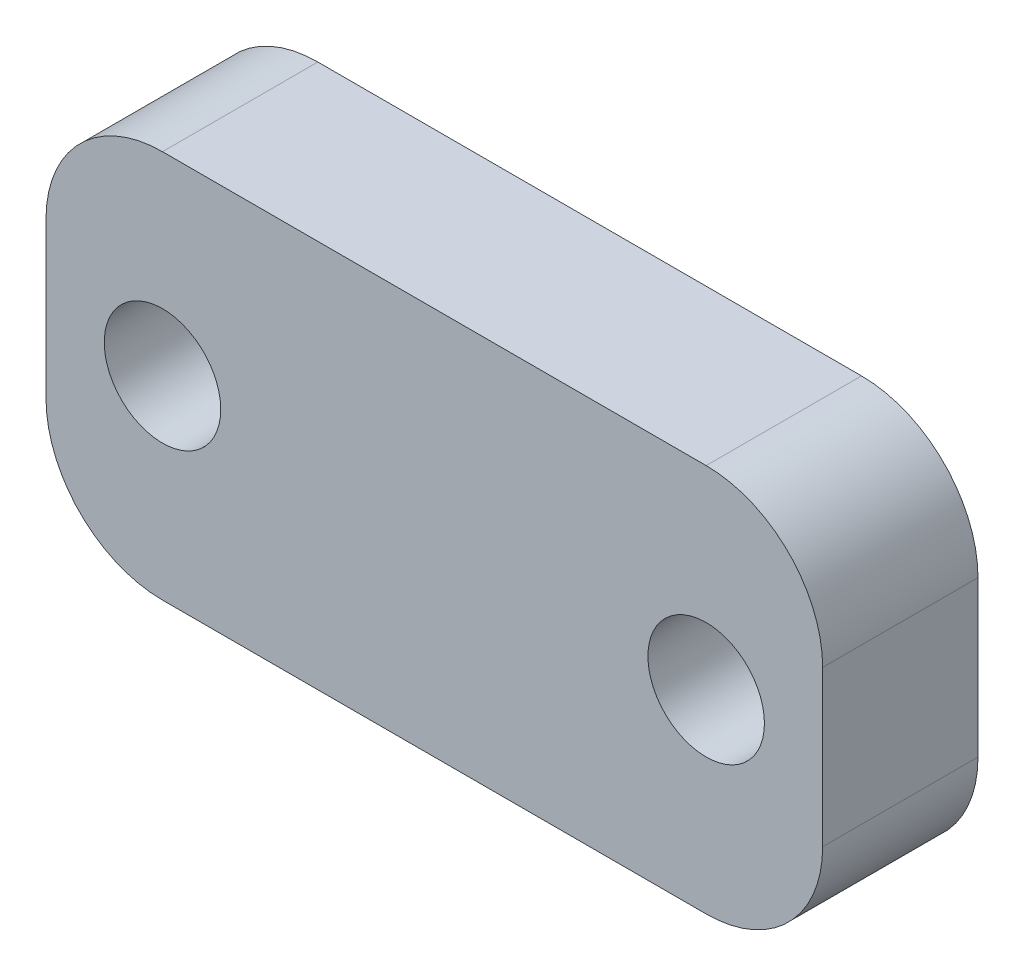
ISO-10303-21;
HEADER;
FILE_DESCRIPTION(('STEP AP214'),'2;1');
FILE_NAME('part.step','',(''),(''),'','','');
FILE_SCHEMA(('AUTOMOTIVE_DESIGN { 1 0 10303 214 1 1 1 1 }'));
ENDSEC;
DATA;
#1=APPLICATION_CONTEXT('core data for automotive mechanical design processes');
#2=APPLICATION_PROTOCOL_DEFINITION('international standard','automotive_design',2000,#1);
#3=PRODUCT_CONTEXT('',#1,'mechanical');
#4=PRODUCT('Part','Part','',(#3));
#5=PRODUCT_RELATED_PRODUCT_CATEGORY('part','',(#4));
#6=PRODUCT_DEFINITION_FORMATION('','',#4);
#7=PRODUCT_DEFINITION_CONTEXT('part definition',#1,'design');
#8=PRODUCT_DEFINITION('design','',#6,#7);
#9=PRODUCT_DEFINITION_SHAPE('','',#8);
#10=(LENGTH_UNIT() NAMED_UNIT(*) SI_UNIT(.MILLI.,.METRE.));
#11=(NAMED_UNIT(*) PLANE_ANGLE_UNIT() SI_UNIT($,.RADIAN.));
#12=(NAMED_UNIT(*) SI_UNIT($,.STERADIAN.) SOLID_ANGLE_UNIT());
#13=UNCERTAINTY_MEASURE_WITH_UNIT(LENGTH_MEASURE(1.E-05),#10,'distance_accuracy_value','');
#14=(GEOMETRIC_REPRESENTATION_CONTEXT(3) GLOBAL_UNCERTAINTY_ASSIGNED_CONTEXT((#13)) GLOBAL_UNIT_ASSIGNED_CONTEXT((#10,
#11,#12)) REPRESENTATION_CONTEXT('',''));
#15=CARTESIAN_POINT('',(0.,0.,0.));
#16=DIRECTION('',(0.,0.,1.));
#17=DIRECTION('',(1.,0.,0.));
#18=AXIS2_PLACEMENT_3D('',#15,#16,#17);
#19=CARTESIAN_POINT('',(-7.,-2.,4.));
#20=DIRECTION('',(0.,0.,1.));
#21=DIRECTION('',(1.,0.,0.));
#22=AXIS2_PLACEMENT_3D('',#19,#20,#21);
#23=PLANE('',#22);
#24=CARTESIAN_POINT('',(-7.,0.,4.));
#25=DIRECTION('',(0.,0.,1.));
#26=DIRECTION('',(1.,0.,0.));
#27=AXIS2_PLACEMENT_3D('',#24,#25,#26);
#28=CIRCLE('',#27,1.5);
#29=CARTESIAN_POINT('',(-5.5,0.,4.));
#30=VERTEX_POINT('',#29);
#31=EDGE_CURVE('E136',#30,#30,#28,.T.);
#32=ORIENTED_EDGE('',*,*,#31,.F.);
#33=EDGE_LOOP('',(#32));
#34=FACE_BOUND('',#33,.T.);
#35=CARTESIAN_POINT('',(-7.,-2.,4.));
#36=DIRECTION('',(0.,0.,1.));
#37=DIRECTION('',(1.,0.,0.));
#38=AXIS2_PLACEMENT_3D('',#35,#36,#37);
#39=CIRCLE('',#38,3.);
#40=CARTESIAN_POINT('',(-10.,-1.99999999999998,4.));
#41=VERTEX_POINT('',#40);
#42=CARTESIAN_POINT('',(-6.99999999999998,-5.,4.));
#43=VERTEX_POINT('',#42);
#44=EDGE_CURVE('E147',#41,#43,#39,.T.);
#45=ORIENTED_EDGE('',*,*,#44,.T.);
#46=DIRECTION('',(1.,0.,0.));
#47=VECTOR('',#46,1.);
#48=CARTESIAN_POINT('',(-6.99999999999998,-5.,4.));
#49=LINE('',#48,#47);
#50=CARTESIAN_POINT('',(6.99999999999998,-5.,4.));
#51=VERTEX_POINT('',#50);
#52=EDGE_CURVE('E95',#43,#51,#49,.T.);
#53=ORIENTED_EDGE('',*,*,#52,.T.);
#54=CARTESIAN_POINT('',(7.,-2.,4.));
#55=DIRECTION('',(0.,0.,1.));
#56=DIRECTION('',(1.,0.,0.));
#57=AXIS2_PLACEMENT_3D('',#54,#55,#56);
#58=CIRCLE('',#57,3.);
#59=CARTESIAN_POINT('',(10.,-1.99999999999998,4.));
#60=VERTEX_POINT('',#59);
#61=EDGE_CURVE('E162',#51,#60,#58,.T.);
#62=ORIENTED_EDGE('',*,*,#61,.T.);
#63=DIRECTION('',(0.,1.,0.));
#64=VECTOR('',#63,1.);
#65=CARTESIAN_POINT('',(10.,1.99999999999998,4.));
#66=LINE('',#65,#64);
#67=CARTESIAN_POINT('',(10.,1.99999999999998,4.));
#68=VERTEX_POINT('',#67);
#69=EDGE_CURVE('E175',#60,#68,#66,.T.);
#70=ORIENTED_EDGE('',*,*,#69,.T.);
#71=CARTESIAN_POINT('',(7.,2.,4.));
#72=DIRECTION('',(0.,0.,1.));
#73=DIRECTION('',(-1.,0.,0.));
#74=AXIS2_PLACEMENT_3D('',#71,#72,#73);
#75=CIRCLE('',#74,3.);
#76=CARTESIAN_POINT('',(6.99999999999998,5.,4.));
#77=VERTEX_POINT('',#76);
#78=EDGE_CURVE('E114',#68,#77,#75,.T.);
#79=ORIENTED_EDGE('',*,*,#78,.T.);
#80=DIRECTION('',(-1.,0.,0.));
#81=VECTOR('',#80,1.);
#82=CARTESIAN_POINT('',(-6.99999999999998,5.,4.));
#83=LINE('',#82,#81);
#84=CARTESIAN_POINT('',(-6.99999999999998,5.,4.));
#85=VERTEX_POINT('',#84);
#86=EDGE_CURVE('E108',#77,#85,#83,.T.);
#87=ORIENTED_EDGE('',*,*,#86,.T.);
#88=CARTESIAN_POINT('',(-7.,2.,4.));
#89=DIRECTION('',(0.,0.,1.));
#90=DIRECTION('',(1.,0.,0.));
#91=AXIS2_PLACEMENT_3D('',#88,#89,#90);
#92=CIRCLE('',#91,3.);
#93=CARTESIAN_POINT('',(-10.,1.99999999999998,4.));
#94=VERTEX_POINT('',#93);
#95=EDGE_CURVE('E112',#85,#94,#92,.T.);
#96=ORIENTED_EDGE('',*,*,#95,.T.);
#97=DIRECTION('',(0.,-1.,0.));
#98=VECTOR('',#97,1.);
#99=CARTESIAN_POINT('',(-10.,1.99999999999998,4.));
#100=LINE('',#99,#98);
#101=EDGE_CURVE('E52',#94,#41,#100,.T.);
#102=ORIENTED_EDGE('',*,*,#101,.T.);
#103=EDGE_LOOP('',(#45,#53,#62,#70,#79,#87,#96,#102));
#104=FACE_BOUND('',#103,.T.);
#105=CARTESIAN_POINT('',(7.,0.,4.));
#106=DIRECTION('',(0.,0.,1.));
#107=DIRECTION('',(1.,0.,0.));
#108=AXIS2_PLACEMENT_3D('',#105,#106,#107);
#109=CIRCLE('',#108,1.5);
#110=CARTESIAN_POINT('',(8.5,0.,4.));
#111=VERTEX_POINT('',#110);
#112=EDGE_CURVE('E184',#111,#111,#109,.T.);
#113=ORIENTED_EDGE('',*,*,#112,.F.);
#114=EDGE_LOOP('',(#113));
#115=FACE_BOUND('',#114,.T.);
#116=ADVANCED_FACE('F35',(#34,#104,#115),#23,.T.);
#117=CARTESIAN_POINT('',(-7.,-2.,0.));
#118=DIRECTION('',(0.,0.,1.));
#119=DIRECTION('',(1.,0.,0.));
#120=AXIS2_PLACEMENT_3D('',#117,#118,#119);
#121=PLANE('',#120);
#122=CARTESIAN_POINT('',(-7.,-2.,0.));
#123=DIRECTION('',(0.,0.,1.));
#124=DIRECTION('',(1.,0.,0.));
#125=AXIS2_PLACEMENT_3D('',#122,#123,#124);
#126=CIRCLE('',#125,3.);
#127=CARTESIAN_POINT('',(-10.,-1.99999999999998,0.));
#128=VERTEX_POINT('',#127);
#129=CARTESIAN_POINT('',(-6.99999999999998,-5.,0.));
#130=VERTEX_POINT('',#129);
#131=EDGE_CURVE('E132',#128,#130,#126,.T.);
#132=ORIENTED_EDGE('',*,*,#131,.F.);
#133=DIRECTION('',(0.,-1.,0.));
#134=VECTOR('',#133,1.);
#135=CARTESIAN_POINT('',(-10.,1.99999999999998,0.));
#136=LINE('',#135,#134);
#137=CARTESIAN_POINT('',(-10.,1.99999999999998,0.));
#138=VERTEX_POINT('',#137);
#139=EDGE_CURVE('E87',#138,#128,#136,.T.);
#140=ORIENTED_EDGE('',*,*,#139,.F.);
#141=CARTESIAN_POINT('',(-7.,2.,0.));
#142=DIRECTION('',(0.,0.,1.));
#143=DIRECTION('',(1.,0.,0.));
#144=AXIS2_PLACEMENT_3D('',#141,#142,#143);
#145=CIRCLE('',#144,3.);
#146=CARTESIAN_POINT('',(-6.99999999999998,5.,0.));
#147=VERTEX_POINT('',#146);
#148=EDGE_CURVE('E81',#147,#138,#145,.T.);
#149=ORIENTED_EDGE('',*,*,#148,.F.);
#150=DIRECTION('',(-1.,0.,0.));
#151=VECTOR('',#150,1.);
#152=CARTESIAN_POINT('',(-6.99999999999998,5.,0.));
#153=LINE('',#152,#151);
#154=CARTESIAN_POINT('',(6.99999999999998,5.,0.));
#155=VERTEX_POINT('',#154);
#156=EDGE_CURVE('E122',#155,#147,#153,.T.);
#157=ORIENTED_EDGE('',*,*,#156,.F.);
#158=CARTESIAN_POINT('',(7.,2.,0.));
#159=DIRECTION('',(0.,0.,1.));
#160=DIRECTION('',(-1.,0.,0.));
#161=AXIS2_PLACEMENT_3D('',#158,#159,#160);
#162=CIRCLE('',#161,3.);
#163=CARTESIAN_POINT('',(10.,1.99999999999998,0.));
#164=VERTEX_POINT('',#163);
#165=EDGE_CURVE('E142',#164,#155,#162,.T.);
#166=ORIENTED_EDGE('',*,*,#165,.F.);
#167=DIRECTION('',(0.,1.,0.));
#168=VECTOR('',#167,1.);
#169=CARTESIAN_POINT('',(10.,1.99999999999998,0.));
#170=LINE('',#169,#168);
#171=CARTESIAN_POINT('',(10.,-1.99999999999998,0.));
#172=VERTEX_POINT('',#171);
#173=EDGE_CURVE('E140',#172,#164,#170,.T.);
#174=ORIENTED_EDGE('',*,*,#173,.F.);
#175=CARTESIAN_POINT('',(7.,-2.,0.));
#176=DIRECTION('',(0.,0.,1.));
#177=DIRECTION('',(1.,0.,0.));
#178=AXIS2_PLACEMENT_3D('',#175,#176,#177);
#179=CIRCLE('',#178,3.);
#180=CARTESIAN_POINT('',(6.99999999999998,-5.,0.));
#181=VERTEX_POINT('',#180);
#182=EDGE_CURVE('E138',#181,#172,#179,.T.);
#183=ORIENTED_EDGE('',*,*,#182,.F.);
#184=DIRECTION('',(1.,0.,0.));
#185=VECTOR('',#184,1.);
#186=CARTESIAN_POINT('',(-6.99999999999998,-5.,0.));
#187=LINE('',#186,#185);
#188=EDGE_CURVE('E135',#130,#181,#187,.T.);
#189=ORIENTED_EDGE('',*,*,#188,.F.);
#190=EDGE_LOOP('',(#132,#140,#149,#157,#166,#174,#183,#189));
#191=FACE_BOUND('',#190,.T.);
#192=CARTESIAN_POINT('',(-7.,0.,0.));
#193=DIRECTION('',(0.,0.,1.));
#194=DIRECTION('',(1.,0.,0.));
#195=AXIS2_PLACEMENT_3D('',#192,#193,#194);
#196=CIRCLE('',#195,1.5);
#197=CARTESIAN_POINT('',(-5.5,0.,0.));
#198=VERTEX_POINT('',#197);
#199=EDGE_CURVE('E181',#198,#198,#196,.T.);
#200=ORIENTED_EDGE('',*,*,#199,.T.);
#201=EDGE_LOOP('',(#200));
#202=FACE_BOUND('',#201,.T.);
#203=CARTESIAN_POINT('',(7.,0.,0.));
#204=DIRECTION('',(0.,0.,1.));
#205=DIRECTION('',(1.,0.,0.));
#206=AXIS2_PLACEMENT_3D('',#203,#204,#205);
#207=CIRCLE('',#206,1.5);
#208=CARTESIAN_POINT('',(8.5,0.,0.));
#209=VERTEX_POINT('',#208);
#210=EDGE_CURVE('E187',#209,#209,#207,.T.);
#211=ORIENTED_EDGE('',*,*,#210,.T.);
#212=EDGE_LOOP('',(#211));
#213=FACE_BOUND('',#212,.T.);
#214=ADVANCED_FACE('F166',(#191,#202,#213),#121,.F.);
#215=CARTESIAN_POINT('',(-7.,-2.,4.));
#216=DIRECTION('',(0.,0.,-1.));
#217=DIRECTION('',(-1.,0.,0.));
#218=AXIS2_PLACEMENT_3D('',#215,#216,#217);
#219=CYLINDRICAL_SURFACE('',#218,3.);
#220=ORIENTED_EDGE('',*,*,#131,.T.);
#221=DIRECTION('',(0.,0.,-1.));
#222=VECTOR('',#221,1.);
#223=CARTESIAN_POINT('',(-6.99999999999998,-5.,4.));
#224=LINE('',#223,#222);
#225=EDGE_CURVE('E11',#43,#130,#224,.T.);
#226=ORIENTED_EDGE('',*,*,#225,.F.);
#227=ORIENTED_EDGE('',*,*,#44,.F.);
#228=DIRECTION('',(0.,0.,-1.));
#229=VECTOR('',#228,1.);
#230=CARTESIAN_POINT('',(-10.,-1.99999999999998,4.));
#231=LINE('',#230,#229);
#232=EDGE_CURVE('E128',#41,#128,#231,.T.);
#233=ORIENTED_EDGE('',*,*,#232,.T.);
#234=EDGE_LOOP('',(#220,#226,#227,#233));
#235=FACE_BOUND('',#234,.T.);
#236=ADVANCED_FACE('F37',(#235),#219,.T.);
#237=CARTESIAN_POINT('',(-6.99999999999998,-5.,4.));
#238=DIRECTION('',(0.,1.,0.));
#239=DIRECTION('',(0.,0.,1.));
#240=AXIS2_PLACEMENT_3D('',#237,#238,#239);
#241=PLANE('',#240);
#242=ORIENTED_EDGE('',*,*,#188,.T.);
#243=DIRECTION('',(0.,0.,-1.));
#244=VECTOR('',#243,1.);
#245=CARTESIAN_POINT('',(6.99999999999998,-5.,4.));
#246=LINE('',#245,#244);
#247=EDGE_CURVE('E44',#51,#181,#246,.T.);
#248=ORIENTED_EDGE('',*,*,#247,.F.);
#249=ORIENTED_EDGE('',*,*,#52,.F.);
#250=ORIENTED_EDGE('',*,*,#225,.T.);
#251=EDGE_LOOP('',(#242,#248,#249,#250));
#252=FACE_BOUND('',#251,.T.);
#253=ADVANCED_FACE('F219',(#252),#241,.F.);
#254=CARTESIAN_POINT('',(7.,-2.,4.));
#255=DIRECTION('',(0.,0.,-1.));
#256=DIRECTION('',(-1.,0.,0.));
#257=AXIS2_PLACEMENT_3D('',#254,#255,#256);
#258=CYLINDRICAL_SURFACE('',#257,3.);
#259=ORIENTED_EDGE('',*,*,#182,.T.);
#260=DIRECTION('',(0.,0.,-1.));
#261=VECTOR('',#260,1.);
#262=CARTESIAN_POINT('',(10.,-1.99999999999998,4.));
#263=LINE('',#262,#261);
#264=EDGE_CURVE('E154',#60,#172,#263,.T.);
#265=ORIENTED_EDGE('',*,*,#264,.F.);
#266=ORIENTED_EDGE('',*,*,#61,.F.);
#267=ORIENTED_EDGE('',*,*,#247,.T.);
#268=EDGE_LOOP('',(#259,#265,#266,#267));
#269=FACE_BOUND('',#268,.T.);
#270=ADVANCED_FACE('F160',(#269),#258,.T.);
#271=CARTESIAN_POINT('',(10.,1.99999999999998,4.));
#272=DIRECTION('',(-1.,0.,0.));
#273=DIRECTION('',(0.,0.,1.));
#274=AXIS2_PLACEMENT_3D('',#271,#272,#273);
#275=PLANE('',#274);
#276=ORIENTED_EDGE('',*,*,#173,.T.);
#277=DIRECTION('',(0.,0.,-1.));
#278=VECTOR('',#277,1.);
#279=CARTESIAN_POINT('',(10.,1.99999999999998,4.));
#280=LINE('',#279,#278);
#281=EDGE_CURVE('E151',#68,#164,#280,.T.);
#282=ORIENTED_EDGE('',*,*,#281,.F.);
#283=ORIENTED_EDGE('',*,*,#69,.F.);
#284=ORIENTED_EDGE('',*,*,#264,.T.);
#285=EDGE_LOOP('',(#276,#282,#283,#284));
#286=FACE_BOUND('',#285,.T.);
#287=ADVANCED_FACE('F171',(#286),#275,.F.);
#288=CARTESIAN_POINT('',(7.,2.,4.));
#289=DIRECTION('',(0.,0.,-1.));
#290=DIRECTION('',(-1.,0.,0.));
#291=AXIS2_PLACEMENT_3D('',#288,#289,#290);
#292=CYLINDRICAL_SURFACE('',#291,3.);
#293=ORIENTED_EDGE('',*,*,#165,.T.);
#294=DIRECTION('',(0.,0.,-1.));
#295=VECTOR('',#294,1.);
#296=CARTESIAN_POINT('',(6.99999999999998,5.,4.));
#297=LINE('',#296,#295);
#298=EDGE_CURVE('E123',#77,#155,#297,.T.);
#299=ORIENTED_EDGE('',*,*,#298,.F.);
#300=ORIENTED_EDGE('',*,*,#78,.F.);
#301=ORIENTED_EDGE('',*,*,#281,.T.);
#302=EDGE_LOOP('',(#293,#299,#300,#301));
#303=FACE_BOUND('',#302,.T.);
#304=ADVANCED_FACE('F174',(#303),#292,.T.);
#305=CARTESIAN_POINT('',(-6.99999999999998,5.,4.));
#306=DIRECTION('',(0.,-1.,0.));
#307=DIRECTION('',(0.,0.,-1.));
#308=AXIS2_PLACEMENT_3D('',#305,#306,#307);
#309=PLANE('',#308);
#310=ORIENTED_EDGE('',*,*,#156,.T.);
#311=DIRECTION('',(0.,0.,-1.));
#312=VECTOR('',#311,1.);
#313=CARTESIAN_POINT('',(-6.99999999999998,5.,4.));
#314=LINE('',#313,#312);
#315=EDGE_CURVE('E119',#85,#147,#314,.T.);
#316=ORIENTED_EDGE('',*,*,#315,.F.);
#317=ORIENTED_EDGE('',*,*,#86,.F.);
#318=ORIENTED_EDGE('',*,*,#298,.T.);
#319=EDGE_LOOP('',(#310,#316,#317,#318));
#320=FACE_BOUND('',#319,.T.);
#321=ADVANCED_FACE('F120',(#320),#309,.F.);
#322=CARTESIAN_POINT('',(-7.,2.,4.));
#323=DIRECTION('',(0.,0.,-1.));
#324=DIRECTION('',(-1.,0.,0.));
#325=AXIS2_PLACEMENT_3D('',#322,#323,#324);
#326=CYLINDRICAL_SURFACE('',#325,3.);
#327=ORIENTED_EDGE('',*,*,#148,.T.);
#328=DIRECTION('',(0.,0.,-1.));
#329=VECTOR('',#328,1.);
#330=CARTESIAN_POINT('',(-10.,1.99999999999998,4.));
#331=LINE('',#330,#329);
#332=EDGE_CURVE('E124',#94,#138,#331,.T.);
#333=ORIENTED_EDGE('',*,*,#332,.F.);
#334=ORIENTED_EDGE('',*,*,#95,.F.);
#335=ORIENTED_EDGE('',*,*,#315,.T.);
#336=EDGE_LOOP('',(#327,#333,#334,#335));
#337=FACE_BOUND('',#336,.T.);
#338=ADVANCED_FACE('F126',(#337),#326,.T.);
#339=CARTESIAN_POINT('',(-10.,1.99999999999998,4.));
#340=DIRECTION('',(1.,0.,0.));
#341=DIRECTION('',(0.,1.,0.));
#342=AXIS2_PLACEMENT_3D('',#339,#340,#341);
#343=PLANE('',#342);
#344=ORIENTED_EDGE('',*,*,#139,.T.);
#345=ORIENTED_EDGE('',*,*,#232,.F.);
#346=ORIENTED_EDGE('',*,*,#101,.F.);
#347=ORIENTED_EDGE('',*,*,#332,.T.);
#348=EDGE_LOOP('',(#344,#345,#346,#347));
#349=FACE_BOUND('',#348,.T.);
#350=ADVANCED_FACE('F207',(#349),#343,.F.);
#351=CARTESIAN_POINT('',(-7.,0.,4.));
#352=DIRECTION('',(0.,0.,-1.));
#353=DIRECTION('',(-1.,0.,0.));
#354=AXIS2_PLACEMENT_3D('',#351,#352,#353);
#355=CYLINDRICAL_SURFACE('',#354,1.5);
#356=ORIENTED_EDGE('',*,*,#31,.T.);
#357=EDGE_LOOP('',(#356));
#358=FACE_BOUND('',#357,.T.);
#359=ORIENTED_EDGE('',*,*,#199,.F.);
#360=EDGE_LOOP('',(#359));
#361=FACE_BOUND('',#360,.T.);
#362=ADVANCED_FACE('F204',(#358,#361),#355,.F.);
#363=CARTESIAN_POINT('',(7.,0.,4.));
#364=DIRECTION('',(0.,0.,-1.));
#365=DIRECTION('',(-1.,0.,0.));
#366=AXIS2_PLACEMENT_3D('',#363,#364,#365);
#367=CYLINDRICAL_SURFACE('',#366,1.5);
#368=ORIENTED_EDGE('',*,*,#112,.T.);
#369=EDGE_LOOP('',(#368));
#370=FACE_BOUND('',#369,.T.);
#371=ORIENTED_EDGE('',*,*,#210,.F.);
#372=EDGE_LOOP('',(#371));
#373=FACE_BOUND('',#372,.T.);
#374=ADVANCED_FACE('F193',(#370,#373),#367,.F.);
#375=CLOSED_SHELL('',(#116,#214,#236,#253,#270,#287,#304,#321,#338,#350,#362,#374));
#376=MANIFOLD_SOLID_BREP('B2',#375);
#377=ADVANCED_BREP_SHAPE_REPRESENTATION('',(#18,#376),#14);
#378=SHAPE_DEFINITION_REPRESENTATION(#9,#377);
ENDSEC;
END-ISO-10303-21;
